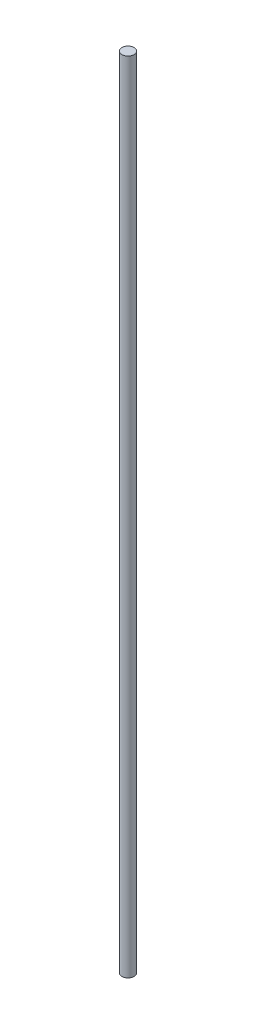
ISO-10303-21;
HEADER;
FILE_DESCRIPTION(('STEP AP214'),'2;1');
FILE_NAME('part.step','',(''),(''),'','','');
FILE_SCHEMA(('AUTOMOTIVE_DESIGN { 1 0 10303 214 1 1 1 1 }'));
ENDSEC;
DATA;
#1=APPLICATION_CONTEXT('core data for automotive mechanical design processes');
#2=APPLICATION_PROTOCOL_DEFINITION('international standard','automotive_design',2000,#1);
#3=PRODUCT_CONTEXT('',#1,'mechanical');
#4=PRODUCT('Part','Part','',(#3));
#5=PRODUCT_RELATED_PRODUCT_CATEGORY('part','',(#4));
#6=PRODUCT_DEFINITION_FORMATION('','',#4);
#7=PRODUCT_DEFINITION_CONTEXT('part definition',#1,'design');
#8=PRODUCT_DEFINITION('design','',#6,#7);
#9=PRODUCT_DEFINITION_SHAPE('','',#8);
#10=(LENGTH_UNIT() NAMED_UNIT(*) SI_UNIT(.MILLI.,.METRE.));
#11=(NAMED_UNIT(*) PLANE_ANGLE_UNIT() SI_UNIT($,.RADIAN.));
#12=(NAMED_UNIT(*) SI_UNIT($,.STERADIAN.) SOLID_ANGLE_UNIT());
#13=UNCERTAINTY_MEASURE_WITH_UNIT(LENGTH_MEASURE(1.E-05),#10,'distance_accuracy_value','');
#14=(GEOMETRIC_REPRESENTATION_CONTEXT(3) GLOBAL_UNCERTAINTY_ASSIGNED_CONTEXT((#13)) GLOBAL_UNIT_ASSIGNED_CONTEXT((#10,
#11,#12)) REPRESENTATION_CONTEXT('',''));
#15=CARTESIAN_POINT('',(0.,0.,0.));
#16=DIRECTION('',(0.,0.,1.));
#17=DIRECTION('',(1.,0.,0.));
#18=AXIS2_PLACEMENT_3D('',#15,#16,#17);
#19=CARTESIAN_POINT('',(0.,520.,0.));
#20=DIRECTION('',(0.,-1.,0.));
#21=DIRECTION('',(0.,0.,-1.));
#22=AXIS2_PLACEMENT_3D('',#19,#20,#21);
#23=CYLINDRICAL_SURFACE('',#22,4.);
#24=CARTESIAN_POINT('',(0.,520.,0.));
#25=DIRECTION('',(0.,1.,0.));
#26=DIRECTION('',(0.,0.,1.));
#27=AXIS2_PLACEMENT_3D('',#24,#25,#26);
#28=CIRCLE('',#27,4.);
#29=CARTESIAN_POINT('',(0.,520.,4.));
#30=VERTEX_POINT('',#29);
#31=EDGE_CURVE('E10',#30,#30,#28,.T.);
#32=ORIENTED_EDGE('',*,*,#31,.F.);
#33=EDGE_LOOP('',(#32));
#34=FACE_BOUND('',#33,.T.);
#35=CARTESIAN_POINT('',(0.,0.,0.));
#36=DIRECTION('',(0.,1.,0.));
#37=DIRECTION('',(0.,0.,1.));
#38=AXIS2_PLACEMENT_3D('',#35,#36,#37);
#39=CIRCLE('',#38,4.);
#40=CARTESIAN_POINT('',(0.,0.,4.));
#41=VERTEX_POINT('',#40);
#42=EDGE_CURVE('E44',#41,#41,#39,.T.);
#43=ORIENTED_EDGE('',*,*,#42,.T.);
#44=EDGE_LOOP('',(#43));
#45=FACE_BOUND('',#44,.T.);
#46=ADVANCED_FACE('F41',(#34,#45),#23,.T.);
#47=CARTESIAN_POINT('',(0.,520.,0.));
#48=DIRECTION('',(0.,1.,0.));
#49=DIRECTION('',(0.,0.,1.));
#50=AXIS2_PLACEMENT_3D('',#47,#48,#49);
#51=PLANE('',#50);
#52=ORIENTED_EDGE('',*,*,#31,.T.);
#53=EDGE_LOOP('',(#52));
#54=FACE_BOUND('',#53,.T.);
#55=ADVANCED_FACE('F58',(#54),#51,.T.);
#56=CARTESIAN_POINT('',(0.,0.,0.));
#57=DIRECTION('',(0.,1.,0.));
#58=DIRECTION('',(0.,0.,1.));
#59=AXIS2_PLACEMENT_3D('',#56,#57,#58);
#60=PLANE('',#59);
#61=ORIENTED_EDGE('',*,*,#42,.F.);
#62=EDGE_LOOP('',(#61));
#63=FACE_BOUND('',#62,.T.);
#64=ADVANCED_FACE('F56',(#63),#60,.F.);
#65=CLOSED_SHELL('',(#46,#55,#64));
#66=MANIFOLD_SOLID_BREP('B2',#65);
#67=ADVANCED_BREP_SHAPE_REPRESENTATION('',(#18,#66),#14);
#68=SHAPE_DEFINITION_REPRESENTATION(#9,#67);
ENDSEC;
END-ISO-10303-21;
